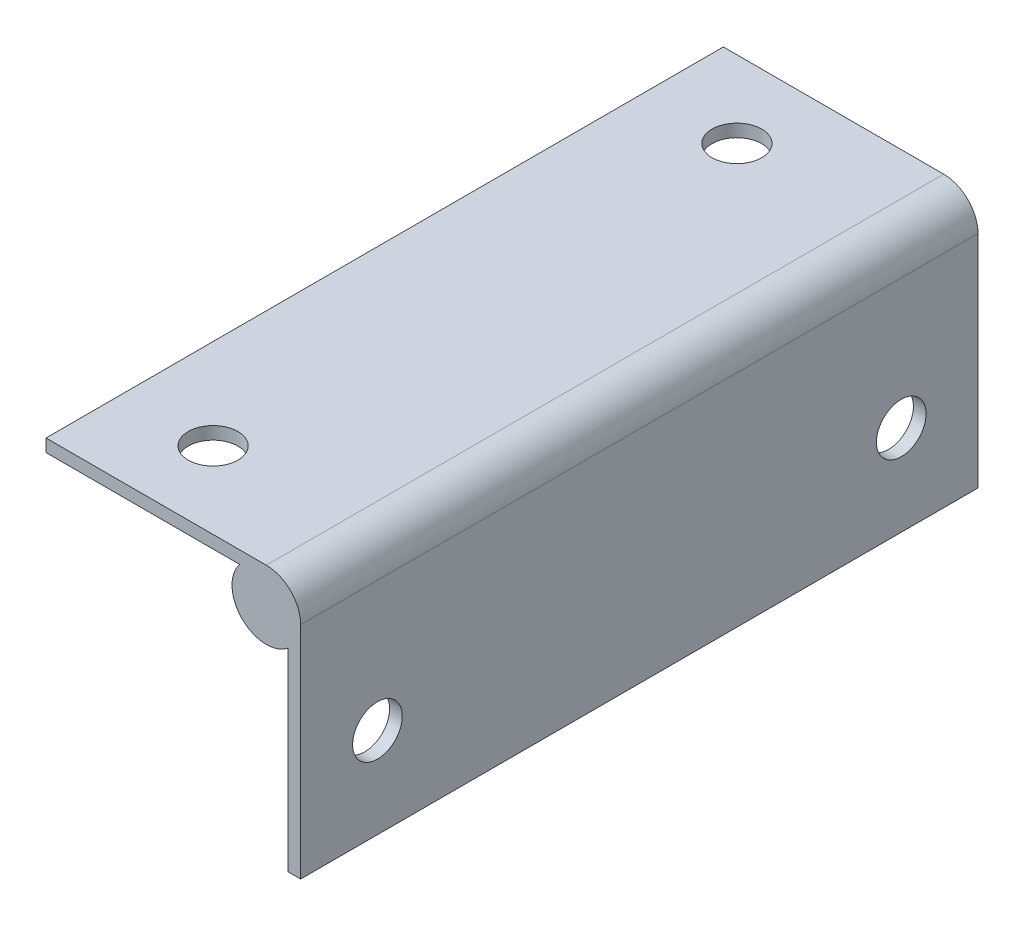
ISO-10303-21;
HEADER;
FILE_DESCRIPTION(('STEP AP214'),'2;1');
FILE_NAME('part.step','',(''),(''),'','','');
FILE_SCHEMA(('AUTOMOTIVE_DESIGN { 1 0 10303 214 1 1 1 1 }'));
ENDSEC;
DATA;
#1=APPLICATION_CONTEXT('core data for automotive mechanical design processes');
#2=APPLICATION_PROTOCOL_DEFINITION('international standard','automotive_design',2000,#1);
#3=PRODUCT_CONTEXT('',#1,'mechanical');
#4=PRODUCT('Part','Part','',(#3));
#5=PRODUCT_RELATED_PRODUCT_CATEGORY('part','',(#4));
#6=PRODUCT_DEFINITION_FORMATION('','',#4);
#7=PRODUCT_DEFINITION_CONTEXT('part definition',#1,'design');
#8=PRODUCT_DEFINITION('design','',#6,#7);
#9=PRODUCT_DEFINITION_SHAPE('','',#8);
#10=(LENGTH_UNIT() NAMED_UNIT(*) SI_UNIT(.MILLI.,.METRE.));
#11=(NAMED_UNIT(*) PLANE_ANGLE_UNIT() SI_UNIT($,.RADIAN.));
#12=(NAMED_UNIT(*) SI_UNIT($,.STERADIAN.) SOLID_ANGLE_UNIT());
#13=UNCERTAINTY_MEASURE_WITH_UNIT(LENGTH_MEASURE(1.E-05),#10,'distance_accuracy_value','');
#14=(GEOMETRIC_REPRESENTATION_CONTEXT(3) GLOBAL_UNCERTAINTY_ASSIGNED_CONTEXT((#13)) GLOBAL_UNIT_ASSIGNED_CONTEXT((#10,
#11,#12)) REPRESENTATION_CONTEXT('',''));
#15=CARTESIAN_POINT('',(0.,0.,0.));
#16=DIRECTION('',(0.,0.,1.));
#17=DIRECTION('',(1.,0.,0.));
#18=AXIS2_PLACEMENT_3D('',#15,#16,#17);
#19=CARTESIAN_POINT('',(0.,2.39999999999999,75.));
#20=DIRECTION('',(0.,1.,0.));
#21=DIRECTION('',(-1.,0.,0.));
#22=AXIS2_PLACEMENT_3D('',#19,#20,#21);
#23=PLANE('',#22);
#24=CARTESIAN_POINT('',(-14.3961839725312,2.39999999999999,8.49999999999999));
#25=DIRECTION('',(0.,1.,0.));
#26=DIRECTION('',(-1.,0.,0.));
#27=AXIS2_PLACEMENT_3D('',#24,#25,#26);
#28=CIRCLE('',#27,2.75);
#29=CARTESIAN_POINT('',(-17.1461839725312,2.39999999999999,8.49999999999999));
#30=VERTEX_POINT('',#29);
#31=EDGE_CURVE('E138',#30,#30,#28,.T.);
#32=ORIENTED_EDGE('',*,*,#31,.T.);
#33=EDGE_LOOP('',(#32));
#34=FACE_BOUND('',#33,.T.);
#35=CARTESIAN_POINT('',(-14.3961839725312,2.39999999999999,66.5));
#36=DIRECTION('',(0.,1.,0.));
#37=DIRECTION('',(-1.,0.,0.));
#38=AXIS2_PLACEMENT_3D('',#35,#36,#37);
#39=CIRCLE('',#38,2.75);
#40=CARTESIAN_POINT('',(-17.1461839725312,2.39999999999999,66.5));
#41=VERTEX_POINT('',#40);
#42=EDGE_CURVE('E181',#41,#41,#39,.T.);
#43=ORIENTED_EDGE('',*,*,#42,.T.);
#44=EDGE_LOOP('',(#43));
#45=FACE_BOUND('',#44,.T.);
#46=DIRECTION('',(1.,0.,0.));
#47=VECTOR('',#46,1.);
#48=CARTESIAN_POINT('',(0.,2.39999999999999,0.));
#49=LINE('',#48,#47);
#50=CARTESIAN_POINT('',(-24.3961839725312,2.4,0.));
#51=VERTEX_POINT('',#50);
#52=CARTESIAN_POINT('',(-2.94618397253125,2.39999999999999,0.));
#53=VERTEX_POINT('',#52);
#54=EDGE_CURVE('E134',#51,#53,#49,.T.);
#55=ORIENTED_EDGE('',*,*,#54,.T.);
#56=DIRECTION('',(0.,0.,-1.));
#57=VECTOR('',#56,1.);
#58=CARTESIAN_POINT('',(-2.94618397253125,2.39999999999999,75.));
#59=LINE('',#58,#57);
#60=CARTESIAN_POINT('',(-2.94618397253125,2.39999999999999,75.));
#61=VERTEX_POINT('',#60);
#62=EDGE_CURVE('E11',#61,#53,#59,.T.);
#63=ORIENTED_EDGE('',*,*,#62,.F.);
#64=DIRECTION('',(1.,0.,0.));
#65=VECTOR('',#64,1.);
#66=CARTESIAN_POINT('',(0.,2.39999999999999,75.));
#67=LINE('',#66,#65);
#68=CARTESIAN_POINT('',(-24.3961839725312,2.4,75.));
#69=VERTEX_POINT('',#68);
#70=EDGE_CURVE('E152',#69,#61,#67,.T.);
#71=ORIENTED_EDGE('',*,*,#70,.F.);
#72=DIRECTION('',(0.,0.,-1.));
#73=VECTOR('',#72,1.);
#74=CARTESIAN_POINT('',(-24.3961839725312,2.4,75.));
#75=LINE('',#74,#73);
#76=EDGE_CURVE('E129',#69,#51,#75,.T.);
#77=ORIENTED_EDGE('',*,*,#76,.T.);
#78=EDGE_LOOP('',(#55,#63,#71,#77));
#79=FACE_BOUND('',#78,.T.);
#80=ADVANCED_FACE('F37',(#34,#45,#79),#23,.F.);
#81=CARTESIAN_POINT('',(0.,0.,75.));
#82=DIRECTION('',(0.,0.,-1.));
#83=DIRECTION('',(-1.,0.,0.));
#84=AXIS2_PLACEMENT_3D('',#81,#82,#83);
#85=CYLINDRICAL_SURFACE('',#84,3.8);
#86=CARTESIAN_POINT('',(0.,0.,0.));
#87=DIRECTION('',(0.,0.,1.));
#88=DIRECTION('',(1.,0.,0.));
#89=AXIS2_PLACEMENT_3D('',#86,#87,#88);
#90=CIRCLE('',#89,3.8);
#91=CARTESIAN_POINT('',(2.4,-2.94618397253124,0.));
#92=VERTEX_POINT('',#91);
#93=EDGE_CURVE('E137',#53,#92,#90,.T.);
#94=ORIENTED_EDGE('',*,*,#93,.T.);
#95=DIRECTION('',(0.,0.,-1.));
#96=VECTOR('',#95,1.);
#97=CARTESIAN_POINT('',(2.4,-2.94618397253124,75.));
#98=LINE('',#97,#96);
#99=CARTESIAN_POINT('',(2.4,-2.94618397253124,75.));
#100=VERTEX_POINT('',#99);
#101=EDGE_CURVE('E45',#100,#92,#98,.T.);
#102=ORIENTED_EDGE('',*,*,#101,.F.);
#103=CARTESIAN_POINT('',(0.,0.,75.));
#104=DIRECTION('',(0.,0.,1.));
#105=DIRECTION('',(1.,0.,0.));
#106=AXIS2_PLACEMENT_3D('',#103,#104,#105);
#107=CIRCLE('',#106,3.8);
#108=EDGE_CURVE('E96',#61,#100,#107,.T.);
#109=ORIENTED_EDGE('',*,*,#108,.F.);
#110=ORIENTED_EDGE('',*,*,#62,.T.);
#111=EDGE_LOOP('',(#94,#102,#109,#110));
#112=FACE_BOUND('',#111,.T.);
#113=ADVANCED_FACE('F165',(#112),#85,.T.);
#114=CARTESIAN_POINT('',(2.39999999999999,0.,75.));
#115=DIRECTION('',(-1.,0.,0.));
#116=DIRECTION('',(0.,-1.,0.));
#117=AXIS2_PLACEMENT_3D('',#114,#115,#116);
#118=PLANE('',#117);
#119=CARTESIAN_POINT('',(2.40000000000005,-14.3961839725312,8.5));
#120=DIRECTION('',(-1.,0.,0.));
#121=DIRECTION('',(0.,-1.,0.));
#122=AXIS2_PLACEMENT_3D('',#119,#120,#121);
#123=CIRCLE('',#122,2.75);
#124=CARTESIAN_POINT('',(2.40000000000007,-17.1461839725312,8.5));
#125=VERTEX_POINT('',#124);
#126=EDGE_CURVE('E188',#125,#125,#123,.F.);
#127=ORIENTED_EDGE('',*,*,#126,.T.);
#128=EDGE_LOOP('',(#127));
#129=FACE_BOUND('',#128,.T.);
#130=CARTESIAN_POINT('',(2.40000000000005,-14.3961839725312,66.5));
#131=DIRECTION('',(-1.,0.,0.));
#132=DIRECTION('',(0.,-1.,0.));
#133=AXIS2_PLACEMENT_3D('',#130,#131,#132);
#134=CIRCLE('',#133,2.75);
#135=CARTESIAN_POINT('',(2.40000000000007,-17.1461839725312,66.5));
#136=VERTEX_POINT('',#135);
#137=EDGE_CURVE('E193',#136,#136,#134,.F.);
#138=ORIENTED_EDGE('',*,*,#137,.T.);
#139=EDGE_LOOP('',(#138));
#140=FACE_BOUND('',#139,.T.);
#141=DIRECTION('',(0.,1.,0.));
#142=VECTOR('',#141,1.);
#143=CARTESIAN_POINT('',(2.39999999999999,0.,0.));
#144=LINE('',#143,#142);
#145=CARTESIAN_POINT('',(2.40000000000011,-24.3961839725312,0.));
#146=VERTEX_POINT('',#145);
#147=EDGE_CURVE('E141',#146,#92,#144,.T.);
#148=ORIENTED_EDGE('',*,*,#147,.F.);
#149=DIRECTION('',(0.,0.,-1.));
#150=VECTOR('',#149,1.);
#151=CARTESIAN_POINT('',(2.40000000000011,-24.3961839725312,75.));
#152=LINE('',#151,#150);
#153=CARTESIAN_POINT('',(2.40000000000011,-24.3961839725312,75.));
#154=VERTEX_POINT('',#153);
#155=EDGE_CURVE('E158',#154,#146,#152,.T.);
#156=ORIENTED_EDGE('',*,*,#155,.F.);
#157=DIRECTION('',(0.,1.,0.));
#158=VECTOR('',#157,1.);
#159=CARTESIAN_POINT('',(2.39999999999999,0.,75.));
#160=LINE('',#159,#158);
#161=EDGE_CURVE('E164',#154,#100,#160,.T.);
#162=ORIENTED_EDGE('',*,*,#161,.T.);
#163=ORIENTED_EDGE('',*,*,#101,.T.);
#164=EDGE_LOOP('',(#148,#156,#162,#163));
#165=FACE_BOUND('',#164,.T.);
#166=ADVANCED_FACE('F162',(#129,#140,#165),#118,.T.);
#167=CARTESIAN_POINT('',(1.8137414169171E-13,-24.3961839725313,75.));
#168=DIRECTION('',(0.,-1.,0.));
#169=DIRECTION('',(1.,0.,0.));
#170=AXIS2_PLACEMENT_3D('',#167,#168,#169);
#171=PLANE('',#170);
#172=DIRECTION('',(-1.,0.,0.));
#173=VECTOR('',#172,1.);
#174=CARTESIAN_POINT('',(1.8137414169171E-13,-24.3961839725313,0.));
#175=LINE('',#174,#173);
#176=CARTESIAN_POINT('',(3.80000000000011,-24.3961839725312,0.));
#177=VERTEX_POINT('',#176);
#178=EDGE_CURVE('E144',#177,#146,#175,.T.);
#179=ORIENTED_EDGE('',*,*,#178,.F.);
#180=DIRECTION('',(0.,0.,-1.));
#181=VECTOR('',#180,1.);
#182=CARTESIAN_POINT('',(3.80000000000011,-24.3961839725312,75.));
#183=LINE('',#182,#181);
#184=CARTESIAN_POINT('',(3.80000000000011,-24.3961839725312,75.));
#185=VERTEX_POINT('',#184);
#186=EDGE_CURVE('E156',#185,#177,#183,.T.);
#187=ORIENTED_EDGE('',*,*,#186,.F.);
#188=DIRECTION('',(-1.,0.,0.));
#189=VECTOR('',#188,1.);
#190=CARTESIAN_POINT('',(1.8137414169171E-13,-24.3961839725313,75.));
#191=LINE('',#190,#189);
#192=EDGE_CURVE('E175',#185,#154,#191,.T.);
#193=ORIENTED_EDGE('',*,*,#192,.T.);
#194=ORIENTED_EDGE('',*,*,#155,.T.);
#195=EDGE_LOOP('',(#179,#187,#193,#194));
#196=FACE_BOUND('',#195,.T.);
#197=ADVANCED_FACE('F173',(#196),#171,.T.);
#198=CARTESIAN_POINT('',(3.8,0.,75.));
#199=DIRECTION('',(1.,0.,0.));
#200=DIRECTION('',(0.,1.,0.));
#201=AXIS2_PLACEMENT_3D('',#198,#199,#200);
#202=PLANE('',#201);
#203=CARTESIAN_POINT('',(3.80000000000005,-14.3961839725312,8.5));
#204=DIRECTION('',(-1.,0.,0.));
#205=DIRECTION('',(0.,-1.,0.));
#206=AXIS2_PLACEMENT_3D('',#203,#204,#205);
#207=CIRCLE('',#206,2.75);
#208=CARTESIAN_POINT('',(3.80000000000006,-17.1461839725312,8.5));
#209=VERTEX_POINT('',#208);
#210=EDGE_CURVE('E196',#209,#209,#207,.T.);
#211=ORIENTED_EDGE('',*,*,#210,.T.);
#212=EDGE_LOOP('',(#211));
#213=FACE_BOUND('',#212,.T.);
#214=CARTESIAN_POINT('',(3.80000000000003,-14.3961839725312,66.5));
#215=DIRECTION('',(-1.,0.,0.));
#216=DIRECTION('',(0.,-1.,0.));
#217=AXIS2_PLACEMENT_3D('',#214,#215,#216);
#218=CIRCLE('',#217,2.75);
#219=CARTESIAN_POINT('',(3.80000000000004,-17.1461839725312,66.5));
#220=VERTEX_POINT('',#219);
#221=EDGE_CURVE('E197',#220,#220,#218,.T.);
#222=ORIENTED_EDGE('',*,*,#221,.T.);
#223=EDGE_LOOP('',(#222));
#224=FACE_BOUND('',#223,.T.);
#225=DIRECTION('',(0.,-1.,0.));
#226=VECTOR('',#225,1.);
#227=CARTESIAN_POINT('',(3.8,0.,0.));
#228=LINE('',#227,#226);
#229=CARTESIAN_POINT('',(3.8,0.,0.));
#230=VERTEX_POINT('',#229);
#231=EDGE_CURVE('E147',#230,#177,#228,.T.);
#232=ORIENTED_EDGE('',*,*,#231,.F.);
#233=DIRECTION('',(0.,0.,-1.));
#234=VECTOR('',#233,1.);
#235=CARTESIAN_POINT('',(3.8,0.,75.));
#236=LINE('',#235,#234);
#237=CARTESIAN_POINT('',(3.8,0.,75.));
#238=VERTEX_POINT('',#237);
#239=EDGE_CURVE('E124',#238,#230,#236,.T.);
#240=ORIENTED_EDGE('',*,*,#239,.F.);
#241=DIRECTION('',(0.,-1.,0.));
#242=VECTOR('',#241,1.);
#243=CARTESIAN_POINT('',(3.8,0.,75.));
#244=LINE('',#243,#242);
#245=EDGE_CURVE('E117',#238,#185,#244,.T.);
#246=ORIENTED_EDGE('',*,*,#245,.T.);
#247=ORIENTED_EDGE('',*,*,#186,.T.);
#248=EDGE_LOOP('',(#232,#240,#246,#247));
#249=FACE_BOUND('',#248,.T.);
#250=ADVANCED_FACE('F203',(#213,#224,#249),#202,.T.);
#251=CARTESIAN_POINT('',(0.,3.8,0.));
#252=VERTEX_POINT('',#251);
#253=EDGE_CURVE('E123',#230,#252,#90,.T.);
#254=ORIENTED_EDGE('',*,*,#253,.T.);
#255=DIRECTION('',(0.,0.,-1.));
#256=VECTOR('',#255,1.);
#257=CARTESIAN_POINT('',(0.,3.8,75.));
#258=LINE('',#257,#256);
#259=CARTESIAN_POINT('',(0.,3.8,75.));
#260=VERTEX_POINT('',#259);
#261=EDGE_CURVE('E120',#260,#252,#258,.T.);
#262=ORIENTED_EDGE('',*,*,#261,.F.);
#263=EDGE_CURVE('E110',#238,#260,#107,.T.);
#264=ORIENTED_EDGE('',*,*,#263,.F.);
#265=ORIENTED_EDGE('',*,*,#239,.T.);
#266=EDGE_LOOP('',(#254,#262,#264,#265));
#267=FACE_BOUND('',#266,.T.);
#268=ADVANCED_FACE('F121',(#267),#85,.T.);
#269=CARTESIAN_POINT('',(0.,3.8,75.));
#270=DIRECTION('',(0.,-1.,0.));
#271=DIRECTION('',(1.,0.,0.));
#272=AXIS2_PLACEMENT_3D('',#269,#270,#271);
#273=PLANE('',#272);
#274=CARTESIAN_POINT('',(-14.3961839725312,3.8,8.49999999999999));
#275=DIRECTION('',(0.,1.,0.));
#276=DIRECTION('',(-1.,0.,0.));
#277=AXIS2_PLACEMENT_3D('',#274,#275,#276);
#278=CIRCLE('',#277,2.75);
#279=CARTESIAN_POINT('',(-17.1461839725312,3.8,8.49999999999999));
#280=VERTEX_POINT('',#279);
#281=EDGE_CURVE('E184',#280,#280,#278,.T.);
#282=ORIENTED_EDGE('',*,*,#281,.F.);
#283=EDGE_LOOP('',(#282));
#284=FACE_BOUND('',#283,.T.);
#285=CARTESIAN_POINT('',(-14.3961839725312,3.8,66.5));
#286=DIRECTION('',(0.,1.,0.));
#287=DIRECTION('',(-1.,0.,0.));
#288=AXIS2_PLACEMENT_3D('',#285,#286,#287);
#289=CIRCLE('',#288,2.75);
#290=CARTESIAN_POINT('',(-17.1461839725312,3.8,66.5));
#291=VERTEX_POINT('',#290);
#292=EDGE_CURVE('E185',#291,#291,#289,.T.);
#293=ORIENTED_EDGE('',*,*,#292,.F.);
#294=EDGE_LOOP('',(#293));
#295=FACE_BOUND('',#294,.T.);
#296=DIRECTION('',(-1.,0.,0.));
#297=VECTOR('',#296,1.);
#298=CARTESIAN_POINT('',(0.,3.8,0.));
#299=LINE('',#298,#297);
#300=CARTESIAN_POINT('',(-24.3961839725312,3.8,0.));
#301=VERTEX_POINT('',#300);
#302=EDGE_CURVE('E82',#252,#301,#299,.T.);
#303=ORIENTED_EDGE('',*,*,#302,.T.);
#304=DIRECTION('',(0.,0.,-1.));
#305=VECTOR('',#304,1.);
#306=CARTESIAN_POINT('',(-24.3961839725312,3.8,75.));
#307=LINE('',#306,#305);
#308=CARTESIAN_POINT('',(-24.3961839725312,3.8,75.));
#309=VERTEX_POINT('',#308);
#310=EDGE_CURVE('E125',#309,#301,#307,.T.);
#311=ORIENTED_EDGE('',*,*,#310,.F.);
#312=DIRECTION('',(-1.,0.,0.));
#313=VECTOR('',#312,1.);
#314=CARTESIAN_POINT('',(0.,3.8,75.));
#315=LINE('',#314,#313);
#316=EDGE_CURVE('E114',#260,#309,#315,.T.);
#317=ORIENTED_EDGE('',*,*,#316,.F.);
#318=ORIENTED_EDGE('',*,*,#261,.T.);
#319=EDGE_LOOP('',(#303,#311,#317,#318));
#320=FACE_BOUND('',#319,.T.);
#321=ADVANCED_FACE('F127',(#284,#295,#320),#273,.F.);
#322=CARTESIAN_POINT('',(-24.3961839725312,0.,75.));
#323=DIRECTION('',(1.,0.,0.));
#324=DIRECTION('',(0.,0.,-1.));
#325=AXIS2_PLACEMENT_3D('',#322,#323,#324);
#326=PLANE('',#325);
#327=DIRECTION('',(0.,-1.,0.));
#328=VECTOR('',#327,1.);
#329=CARTESIAN_POINT('',(-24.3961839725312,0.,0.));
#330=LINE('',#329,#328);
#331=EDGE_CURVE('E88',#301,#51,#330,.T.);
#332=ORIENTED_EDGE('',*,*,#331,.T.);
#333=ORIENTED_EDGE('',*,*,#76,.F.);
#334=DIRECTION('',(0.,-1.,0.));
#335=VECTOR('',#334,1.);
#336=CARTESIAN_POINT('',(-24.3961839725312,0.,75.));
#337=LINE('',#336,#335);
#338=EDGE_CURVE('E53',#309,#69,#337,.T.);
#339=ORIENTED_EDGE('',*,*,#338,.F.);
#340=ORIENTED_EDGE('',*,*,#310,.T.);
#341=EDGE_LOOP('',(#332,#333,#339,#340));
#342=FACE_BOUND('',#341,.T.);
#343=ADVANCED_FACE('F269',(#342),#326,.F.);
#344=CARTESIAN_POINT('',(0.,0.,75.));
#345=DIRECTION('',(0.,0.,1.));
#346=DIRECTION('',(1.,0.,0.));
#347=AXIS2_PLACEMENT_3D('',#344,#345,#346);
#348=PLANE('',#347);
#349=ORIENTED_EDGE('',*,*,#70,.T.);
#350=ORIENTED_EDGE('',*,*,#108,.T.);
#351=ORIENTED_EDGE('',*,*,#161,.F.);
#352=ORIENTED_EDGE('',*,*,#192,.F.);
#353=ORIENTED_EDGE('',*,*,#245,.F.);
#354=ORIENTED_EDGE('',*,*,#263,.T.);
#355=ORIENTED_EDGE('',*,*,#316,.T.);
#356=ORIENTED_EDGE('',*,*,#338,.T.);
#357=EDGE_LOOP('',(#349,#350,#351,#352,#353,#354,#355,#356));
#358=FACE_BOUND('',#357,.T.);
#359=ADVANCED_FACE('F112',(#358),#348,.T.);
#360=CARTESIAN_POINT('',(0.,0.,0.));
#361=DIRECTION('',(0.,0.,1.));
#362=DIRECTION('',(1.,0.,0.));
#363=AXIS2_PLACEMENT_3D('',#360,#361,#362);
#364=PLANE('',#363);
#365=ORIENTED_EDGE('',*,*,#54,.F.);
#366=ORIENTED_EDGE('',*,*,#331,.F.);
#367=ORIENTED_EDGE('',*,*,#302,.F.);
#368=ORIENTED_EDGE('',*,*,#253,.F.);
#369=ORIENTED_EDGE('',*,*,#231,.T.);
#370=ORIENTED_EDGE('',*,*,#178,.T.);
#371=ORIENTED_EDGE('',*,*,#147,.T.);
#372=ORIENTED_EDGE('',*,*,#93,.F.);
#373=EDGE_LOOP('',(#365,#366,#367,#368,#369,#370,#371,#372));
#374=FACE_BOUND('',#373,.T.);
#375=ADVANCED_FACE('F169',(#374),#364,.F.);
#376=CARTESIAN_POINT('',(-14.3961839725312,-71.2,66.5));
#377=DIRECTION('',(0.,1.,0.));
#378=DIRECTION('',(-1.,0.,0.));
#379=AXIS2_PLACEMENT_3D('',#376,#377,#378);
#380=CYLINDRICAL_SURFACE('',#379,2.75);
#381=ORIENTED_EDGE('',*,*,#292,.T.);
#382=EDGE_LOOP('',(#381));
#383=FACE_BOUND('',#382,.T.);
#384=ORIENTED_EDGE('',*,*,#42,.F.);
#385=EDGE_LOOP('',(#384));
#386=FACE_BOUND('',#385,.T.);
#387=ADVANCED_FACE('F292',(#383,#386),#380,.F.);
#388=CARTESIAN_POINT('',(-14.3961839725312,-71.2,8.49999999999999));
#389=DIRECTION('',(0.,1.,0.));
#390=DIRECTION('',(-1.,0.,0.));
#391=AXIS2_PLACEMENT_3D('',#388,#389,#390);
#392=CYLINDRICAL_SURFACE('',#391,2.75);
#393=ORIENTED_EDGE('',*,*,#281,.T.);
#394=EDGE_LOOP('',(#393));
#395=FACE_BOUND('',#394,.T.);
#396=ORIENTED_EDGE('',*,*,#31,.F.);
#397=EDGE_LOOP('',(#396));
#398=FACE_BOUND('',#397,.T.);
#399=ADVANCED_FACE('F214',(#395,#398),#392,.F.);
#400=CARTESIAN_POINT('',(-71.2,-14.3961839725315,66.5));
#401=DIRECTION('',(1.,0.,0.));
#402=DIRECTION('',(0.,1.,0.));
#403=AXIS2_PLACEMENT_3D('',#400,#401,#402);
#404=CYLINDRICAL_SURFACE('',#403,2.75);
#405=ORIENTED_EDGE('',*,*,#137,.F.);
#406=EDGE_LOOP('',(#405));
#407=FACE_BOUND('',#406,.T.);
#408=ORIENTED_EDGE('',*,*,#221,.F.);
#409=EDGE_LOOP('',(#408));
#410=FACE_BOUND('',#409,.T.);
#411=ADVANCED_FACE('F208',(#407,#410),#404,.F.);
#412=CARTESIAN_POINT('',(-71.1999999999999,-14.3961839725315,8.49999999999998));
#413=DIRECTION('',(1.,0.,0.));
#414=DIRECTION('',(0.,1.,0.));
#415=AXIS2_PLACEMENT_3D('',#412,#413,#414);
#416=CYLINDRICAL_SURFACE('',#415,2.75);
#417=ORIENTED_EDGE('',*,*,#126,.F.);
#418=EDGE_LOOP('',(#417));
#419=FACE_BOUND('',#418,.T.);
#420=ORIENTED_EDGE('',*,*,#210,.F.);
#421=EDGE_LOOP('',(#420));
#422=FACE_BOUND('',#421,.T.);
#423=ADVANCED_FACE('F206',(#419,#422),#416,.F.);
#424=CLOSED_SHELL('',(#80,#113,#166,#197,#250,#268,#321,#343,#359,#375,#387,#399,#411,#423));
#425=MANIFOLD_SOLID_BREP('B2',#424);
#426=ADVANCED_BREP_SHAPE_REPRESENTATION('',(#18,#425),#14);
#427=SHAPE_DEFINITION_REPRESENTATION(#9,#426);
ENDSEC;
END-ISO-10303-21;
